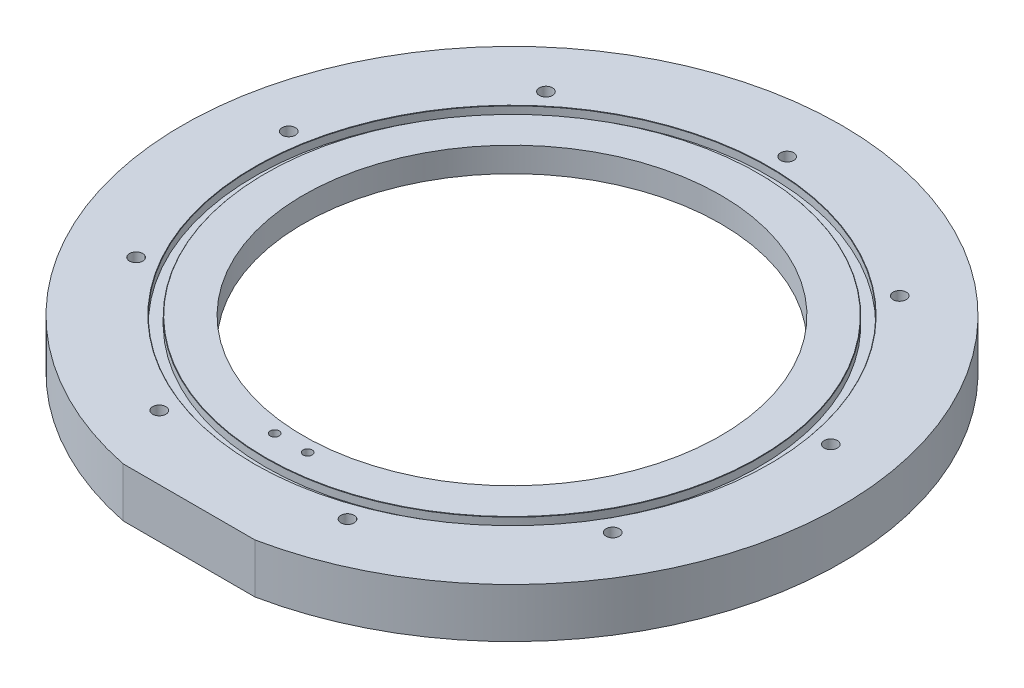
ISO-10303-21;
HEADER;
FILE_DESCRIPTION(('STEP AP214'),'2;1');
FILE_NAME('part.step','',(''),(''),'','','');
FILE_SCHEMA(('AUTOMOTIVE_DESIGN { 1 0 10303 214 1 1 1 1 }'));
ENDSEC;
DATA;
#1=APPLICATION_CONTEXT('core data for automotive mechanical design processes');
#2=APPLICATION_PROTOCOL_DEFINITION('international standard','automotive_design',2000,#1);
#3=PRODUCT_CONTEXT('',#1,'mechanical');
#4=PRODUCT('Part','Part','',(#3));
#5=PRODUCT_RELATED_PRODUCT_CATEGORY('part','',(#4));
#6=PRODUCT_DEFINITION_FORMATION('','',#4);
#7=PRODUCT_DEFINITION_CONTEXT('part definition',#1,'design');
#8=PRODUCT_DEFINITION('design','',#6,#7);
#9=PRODUCT_DEFINITION_SHAPE('','',#8);
#10=(LENGTH_UNIT() NAMED_UNIT(*) SI_UNIT(.MILLI.,.METRE.));
#11=(NAMED_UNIT(*) PLANE_ANGLE_UNIT() SI_UNIT($,.RADIAN.));
#12=(NAMED_UNIT(*) SI_UNIT($,.STERADIAN.) SOLID_ANGLE_UNIT());
#13=UNCERTAINTY_MEASURE_WITH_UNIT(LENGTH_MEASURE(1.E-05),#10,'distance_accuracy_value','');
#14=(GEOMETRIC_REPRESENTATION_CONTEXT(3) GLOBAL_UNCERTAINTY_ASSIGNED_CONTEXT((#13)) GLOBAL_UNIT_ASSIGNED_CONTEXT((#10,
#11,#12)) REPRESENTATION_CONTEXT('',''));
#15=CARTESIAN_POINT('',(0.,0.,0.));
#16=DIRECTION('',(0.,0.,1.));
#17=DIRECTION('',(1.,0.,0.));
#18=AXIS2_PLACEMENT_3D('',#15,#16,#17);
#19=CARTESIAN_POINT('',(105.7783,19.05,0.));
#20=DIRECTION('',(0.,1.,0.));
#21=DIRECTION('',(0.,0.,1.));
#22=AXIS2_PLACEMENT_3D('',#19,#20,#21);
#23=PLANE('',#22);
#24=CARTESIAN_POINT('',(-6.35,19.05,85.09));
#25=DIRECTION('',(0.,1.,0.));
#26=DIRECTION('',(0.,0.,1.));
#27=AXIS2_PLACEMENT_3D('',#24,#25,#26);
#28=CIRCLE('',#27,1.72719999999999);
#29=CARTESIAN_POINT('',(-6.35,19.05,86.8172));
#30=VERTEX_POINT('',#29);
#31=EDGE_CURVE('E627',#30,#30,#28,.T.);
#32=ORIENTED_EDGE('',*,*,#31,.F.);
#33=EDGE_LOOP('',(#32));
#34=FACE_BOUND('',#33,.T.);
#35=CARTESIAN_POINT('',(6.35,19.05,85.09));
#36=DIRECTION('',(0.,1.,0.));
#37=DIRECTION('',(0.,0.,1.));
#38=AXIS2_PLACEMENT_3D('',#35,#36,#37);
#39=CIRCLE('',#38,1.72719999999999);
#40=CARTESIAN_POINT('',(6.35,19.05,86.8172));
#41=VERTEX_POINT('',#40);
#42=EDGE_CURVE('E619',#41,#41,#39,.T.);
#43=ORIENTED_EDGE('',*,*,#42,.F.);
#44=EDGE_LOOP('',(#43));
#45=FACE_BOUND('',#44,.T.);
#46=CARTESIAN_POINT('',(0.,19.05,0.));
#47=DIRECTION('',(0.,1.,0.));
#48=DIRECTION('',(0.,0.,1.));
#49=AXIS2_PLACEMENT_3D('',#46,#47,#48);
#50=CIRCLE('',#49,94.9197999999999);
#51=CARTESIAN_POINT('',(0.,19.05,94.9197999999999));
#52=VERTEX_POINT('',#51);
#53=EDGE_CURVE('E123',#52,#52,#50,.T.);
#54=ORIENTED_EDGE('',*,*,#53,.T.);
#55=EDGE_LOOP('',(#54));
#56=FACE_BOUND('',#55,.T.);
#57=CARTESIAN_POINT('',(0.,19.05,0.));
#58=DIRECTION('',(0.,-1.,0.));
#59=DIRECTION('',(0.,0.,-1.));
#60=AXIS2_PLACEMENT_3D('',#57,#58,#59);
#61=CIRCLE('',#60,80.3783);
#62=CARTESIAN_POINT('',(0.,19.05,-80.3783));
#63=VERTEX_POINT('',#62);
#64=EDGE_CURVE('E119',#63,#63,#61,.T.);
#65=ORIENTED_EDGE('',*,*,#64,.T.);
#66=EDGE_LOOP('',(#65));
#67=FACE_BOUND('',#66,.T.);
#68=ADVANCED_FACE('F44',(#34,#45,#56,#67),#23,.T.);
#69=CARTESIAN_POINT('',(109.7915,0.,0.));
#70=DIRECTION('',(0.,-1.,0.));
#71=DIRECTION('',(0.,0.,-1.));
#72=AXIS2_PLACEMENT_3D('',#69,#70,#71);
#73=PLANE('',#72);
#74=DIRECTION('',(-1.,0.,0.));
#75=VECTOR('',#74,1.);
#76=CARTESIAN_POINT('',(-25.4,0.,124.434078933385));
#77=LINE('',#76,#75);
#78=CARTESIAN_POINT('',(25.4,0.,124.434078933385));
#79=VERTEX_POINT('',#78);
#80=CARTESIAN_POINT('',(-25.4,0.,124.434078933385));
#81=VERTEX_POINT('',#80);
#82=EDGE_CURVE('E106',#79,#81,#77,.T.);
#83=ORIENTED_EDGE('',*,*,#82,.T.);
#84=CARTESIAN_POINT('',(0.,0.,0.));
#85=DIRECTION('',(0.,-1.,0.));
#86=DIRECTION('',(0.,0.,-1.));
#87=AXIS2_PLACEMENT_3D('',#84,#85,#86);
#88=CIRCLE('',#87,127.);
#89=EDGE_CURVE('E113',#81,#79,#88,.T.);
#90=ORIENTED_EDGE('',*,*,#89,.T.);
#91=EDGE_LOOP('',(#83,#90));
#92=FACE_BOUND('',#91,.T.);
#93=CARTESIAN_POINT('',(0.,0.,0.));
#94=DIRECTION('',(0.,-1.,0.));
#95=DIRECTION('',(0.,0.,-1.));
#96=AXIS2_PLACEMENT_3D('',#93,#94,#95);
#97=CIRCLE('',#96,109.7915);
#98=CARTESIAN_POINT('',(0.,0.,-109.7915));
#99=VERTEX_POINT('',#98);
#100=EDGE_CURVE('E535',#99,#99,#97,.T.);
#101=ORIENTED_EDGE('',*,*,#100,.F.);
#102=EDGE_LOOP('',(#101));
#103=FACE_BOUND('',#102,.T.);
#104=ADVANCED_FACE('F157',(#92,#103),#73,.T.);
#105=CARTESIAN_POINT('',(0.,0.,0.));
#106=DIRECTION('',(0.,-1.,0.));
#107=DIRECTION('',(0.,0.,-1.));
#108=AXIS2_PLACEMENT_3D('',#105,#106,#107);
#109=CYLINDRICAL_SURFACE('',#108,127.);
#110=DIRECTION('',(0.,-1.,0.));
#111=VECTOR('',#110,1.);
#112=CARTESIAN_POINT('',(25.4,0.,124.434078933385));
#113=LINE('',#112,#111);
#114=CARTESIAN_POINT('',(25.4,19.05,124.434078933385));
#115=VERTEX_POINT('',#114);
#116=EDGE_CURVE('E61',#115,#79,#113,.T.);
#117=ORIENTED_EDGE('',*,*,#116,.T.);
#118=ORIENTED_EDGE('',*,*,#89,.F.);
#119=DIRECTION('',(0.,-1.,0.));
#120=VECTOR('',#119,1.);
#121=CARTESIAN_POINT('',(-25.4,0.,124.434078933385));
#122=LINE('',#121,#120);
#123=CARTESIAN_POINT('',(-25.4,19.05,124.434078933385));
#124=VERTEX_POINT('',#123);
#125=EDGE_CURVE('E99',#81,#124,#122,.F.);
#126=ORIENTED_EDGE('',*,*,#125,.T.);
#127=CARTESIAN_POINT('',(0.,19.05,0.));
#128=DIRECTION('',(0.,-1.,0.));
#129=DIRECTION('',(0.,0.,-1.));
#130=AXIS2_PLACEMENT_3D('',#127,#128,#129);
#131=CIRCLE('',#130,127.);
#132=EDGE_CURVE('E111',#124,#115,#131,.T.);
#133=ORIENTED_EDGE('',*,*,#132,.T.);
#134=EDGE_LOOP('',(#117,#118,#126,#133));
#135=FACE_BOUND('',#134,.T.);
#136=ADVANCED_FACE('F110',(#135),#109,.T.);
#137=DIRECTION('',(-1.,0.,0.));
#138=VECTOR('',#137,1.);
#139=CARTESIAN_POINT('',(-25.4,19.05,124.434078933385));
#140=LINE('',#139,#138);
#141=EDGE_CURVE('E96',#115,#124,#140,.T.);
#142=ORIENTED_EDGE('',*,*,#141,.F.);
#143=ORIENTED_EDGE('',*,*,#132,.F.);
#144=EDGE_LOOP('',(#142,#143));
#145=FACE_BOUND('',#144,.T.);
#146=CARTESIAN_POINT('',(0.,19.05,0.));
#147=DIRECTION('',(0.,1.,0.));
#148=DIRECTION('',(0.,0.,1.));
#149=AXIS2_PLACEMENT_3D('',#146,#147,#148);
#150=CIRCLE('',#149,99.2378);
#151=CARTESIAN_POINT('',(0.,19.05,99.2378));
#152=VERTEX_POINT('',#151);
#153=EDGE_CURVE('E11',#152,#152,#150,.F.);
#154=ORIENTED_EDGE('',*,*,#153,.T.);
#155=EDGE_LOOP('',(#154));
#156=FACE_BOUND('',#155,.T.);
#157=CARTESIAN_POINT('',(0.,19.05,-106.045));
#158=DIRECTION('',(0.,1.,0.));
#159=DIRECTION('',(0.,0.,1.));
#160=AXIS2_PLACEMENT_3D('',#157,#158,#159);
#161=CIRCLE('',#160,2.55269999999999);
#162=CARTESIAN_POINT('',(0.,19.05,-103.4923));
#163=VERTEX_POINT('',#162);
#164=EDGE_CURVE('E607',#163,#163,#161,.T.);
#165=ORIENTED_EDGE('',*,*,#164,.F.);
#166=EDGE_LOOP('',(#165));
#167=FACE_BOUND('',#166,.T.);
#168=CARTESIAN_POINT('',(68.1644120692091,19.05,-81.235182970552));
#169=DIRECTION('',(0.,1.,0.));
#170=DIRECTION('',(0.,0.,1.));
#171=AXIS2_PLACEMENT_3D('',#168,#169,#170);
#172=CIRCLE('',#171,2.55269999999999);
#173=CARTESIAN_POINT('',(68.1644120692091,19.05,-78.682482970552));
#174=VERTEX_POINT('',#173);
#175=EDGE_CURVE('E599',#174,#174,#172,.T.);
#176=ORIENTED_EDGE('',*,*,#175,.F.);
#177=EDGE_LOOP('',(#176));
#178=FACE_BOUND('',#177,.T.);
#179=CARTESIAN_POINT('',(104.43393816818,19.05,-18.4145210006896));
#180=DIRECTION('',(0.,1.,0.));
#181=DIRECTION('',(0.,0.,1.));
#182=AXIS2_PLACEMENT_3D('',#179,#180,#181);
#183=CIRCLE('',#182,2.55269999999999);
#184=CARTESIAN_POINT('',(104.43393816818,19.05,-15.8618210006896));
#185=VERTEX_POINT('',#184);
#186=EDGE_CURVE('E591',#185,#185,#183,.T.);
#187=ORIENTED_EDGE('',*,*,#186,.F.);
#188=EDGE_LOOP('',(#187));
#189=FACE_BOUND('',#188,.T.);
#190=CARTESIAN_POINT('',(91.8376639443208,19.05,53.0225));
#191=DIRECTION('',(0.,1.,0.));
#192=DIRECTION('',(0.,0.,1.));
#193=AXIS2_PLACEMENT_3D('',#190,#191,#192);
#194=CIRCLE('',#193,2.55269999999999);
#195=CARTESIAN_POINT('',(91.8376639443208,19.05,55.5752));
#196=VERTEX_POINT('',#195);
#197=EDGE_CURVE('E583',#196,#196,#194,.T.);
#198=ORIENTED_EDGE('',*,*,#197,.F.);
#199=EDGE_LOOP('',(#198));
#200=FACE_BOUND('',#199,.T.);
#201=CARTESIAN_POINT('',(36.2695260989706,19.05,99.6497039712416));
#202=DIRECTION('',(0.,1.,0.));
#203=DIRECTION('',(0.,0.,1.));
#204=AXIS2_PLACEMENT_3D('',#201,#202,#203);
#205=CIRCLE('',#204,2.55269999999999);
#206=CARTESIAN_POINT('',(36.2695260989706,19.05,102.202403971242));
#207=VERTEX_POINT('',#206);
#208=EDGE_CURVE('E575',#207,#207,#205,.T.);
#209=ORIENTED_EDGE('',*,*,#208,.F.);
#210=EDGE_LOOP('',(#209));
#211=FACE_BOUND('',#210,.T.);
#212=CARTESIAN_POINT('',(-36.2695260989705,19.05,99.6497039712416));
#213=DIRECTION('',(0.,1.,0.));
#214=DIRECTION('',(0.,0.,1.));
#215=AXIS2_PLACEMENT_3D('',#212,#213,#214);
#216=CIRCLE('',#215,2.55269999999999);
#217=CARTESIAN_POINT('',(-36.2695260989705,19.05,102.202403971242));
#218=VERTEX_POINT('',#217);
#219=EDGE_CURVE('E567',#218,#218,#216,.T.);
#220=ORIENTED_EDGE('',*,*,#219,.F.);
#221=EDGE_LOOP('',(#220));
#222=FACE_BOUND('',#221,.T.);
#223=CARTESIAN_POINT('',(-91.8376639443208,19.05,53.0225));
#224=DIRECTION('',(0.,1.,0.));
#225=DIRECTION('',(0.,0.,1.));
#226=AXIS2_PLACEMENT_3D('',#223,#224,#225);
#227=CIRCLE('',#226,2.55269999999999);
#228=CARTESIAN_POINT('',(-91.8376639443208,19.05,55.5752));
#229=VERTEX_POINT('',#228);
#230=EDGE_CURVE('E559',#229,#229,#227,.T.);
#231=ORIENTED_EDGE('',*,*,#230,.F.);
#232=EDGE_LOOP('',(#231));
#233=FACE_BOUND('',#232,.T.);
#234=CARTESIAN_POINT('',(-104.43393816818,19.05,-18.4145210006896));
#235=DIRECTION('',(0.,1.,0.));
#236=DIRECTION('',(0.,0.,1.));
#237=AXIS2_PLACEMENT_3D('',#234,#235,#236);
#238=CIRCLE('',#237,2.55269999999999);
#239=CARTESIAN_POINT('',(-104.43393816818,19.05,-15.8618210006896));
#240=VERTEX_POINT('',#239);
#241=EDGE_CURVE('E551',#240,#240,#238,.T.);
#242=ORIENTED_EDGE('',*,*,#241,.F.);
#243=EDGE_LOOP('',(#242));
#244=FACE_BOUND('',#243,.T.);
#245=CARTESIAN_POINT('',(-68.1644120692091,19.05,-81.235182970552));
#246=DIRECTION('',(0.,1.,0.));
#247=DIRECTION('',(0.,0.,1.));
#248=AXIS2_PLACEMENT_3D('',#245,#246,#247);
#249=CIRCLE('',#248,2.55269999999999);
#250=CARTESIAN_POINT('',(-68.1644120692091,19.05,-78.682482970552));
#251=VERTEX_POINT('',#250);
#252=EDGE_CURVE('E543',#251,#251,#249,.T.);
#253=ORIENTED_EDGE('',*,*,#252,.F.);
#254=EDGE_LOOP('',(#253));
#255=FACE_BOUND('',#254,.T.);
#256=ADVANCED_FACE('F116',(#145,#156,#167,#178,#189,#200,#211,#222,#233,#244,#255),#23,.T.);
#257=CARTESIAN_POINT('',(0.,0.,0.));
#258=DIRECTION('',(0.,-1.,0.));
#259=DIRECTION('',(0.,0.,-1.));
#260=AXIS2_PLACEMENT_3D('',#257,#258,#259);
#261=CYLINDRICAL_SURFACE('',#260,80.3783);
#262=CARTESIAN_POINT('',(0.,9.52499999999999,0.));
#263=DIRECTION('',(0.,-1.,0.));
#264=DIRECTION('',(0.,0.,-1.));
#265=AXIS2_PLACEMENT_3D('',#262,#263,#264);
#266=CIRCLE('',#265,80.3783);
#267=CARTESIAN_POINT('',(0.,9.52499999999999,-80.3783));
#268=VERTEX_POINT('',#267);
#269=EDGE_CURVE('E126',#268,#268,#266,.T.);
#270=ORIENTED_EDGE('',*,*,#269,.T.);
#271=EDGE_LOOP('',(#270));
#272=FACE_BOUND('',#271,.T.);
#273=ORIENTED_EDGE('',*,*,#64,.F.);
#274=EDGE_LOOP('',(#273));
#275=FACE_BOUND('',#274,.T.);
#276=ADVANCED_FACE('F170',(#272,#275),#261,.F.);
#277=CARTESIAN_POINT('',(80.3783,9.525,0.));
#278=DIRECTION('',(0.,-1.,0.));
#279=DIRECTION('',(0.,0.,-1.));
#280=AXIS2_PLACEMENT_3D('',#277,#278,#279);
#281=PLANE('',#280);
#282=CARTESIAN_POINT('',(-6.35,9.52499999999999,85.09));
#283=DIRECTION('',(0.,-1.,0.));
#284=DIRECTION('',(0.,0.,-1.));
#285=AXIS2_PLACEMENT_3D('',#282,#283,#284);
#286=CIRCLE('',#285,1.72719999999999);
#287=CARTESIAN_POINT('',(-6.35,9.52499999999999,83.3628));
#288=VERTEX_POINT('',#287);
#289=EDGE_CURVE('E105',#288,#288,#286,.T.);
#290=ORIENTED_EDGE('',*,*,#289,.F.);
#291=EDGE_LOOP('',(#290));
#292=FACE_BOUND('',#291,.T.);
#293=CARTESIAN_POINT('',(6.35,9.52499999999999,85.09));
#294=DIRECTION('',(0.,-1.,0.));
#295=DIRECTION('',(0.,0.,-1.));
#296=AXIS2_PLACEMENT_3D('',#293,#294,#295);
#297=CIRCLE('',#296,1.72719999999999);
#298=CARTESIAN_POINT('',(6.35,9.52499999999999,83.3628));
#299=VERTEX_POINT('',#298);
#300=EDGE_CURVE('E623',#299,#299,#297,.T.);
#301=ORIENTED_EDGE('',*,*,#300,.F.);
#302=EDGE_LOOP('',(#301));
#303=FACE_BOUND('',#302,.T.);
#304=CARTESIAN_POINT('',(0.,9.525,0.));
#305=DIRECTION('',(0.,-1.,0.));
#306=DIRECTION('',(0.,0.,-1.));
#307=AXIS2_PLACEMENT_3D('',#304,#305,#306);
#308=CIRCLE('',#307,99.4283);
#309=CARTESIAN_POINT('',(0.,9.525,-99.4283));
#310=VERTEX_POINT('',#309);
#311=EDGE_CURVE('E522',#310,#310,#308,.T.);
#312=ORIENTED_EDGE('',*,*,#311,.T.);
#313=EDGE_LOOP('',(#312));
#314=FACE_BOUND('',#313,.T.);
#315=ORIENTED_EDGE('',*,*,#269,.F.);
#316=EDGE_LOOP('',(#315));
#317=FACE_BOUND('',#316,.T.);
#318=ADVANCED_FACE('F175',(#292,#303,#314,#317),#281,.T.);
#319=CARTESIAN_POINT('',(0.,0.,0.));
#320=DIRECTION('',(0.,-1.,0.));
#321=DIRECTION('',(0.,0.,-1.));
#322=AXIS2_PLACEMENT_3D('',#319,#320,#321);
#323=CYLINDRICAL_SURFACE('',#322,99.4283);
#324=CARTESIAN_POINT('',(0.,2.54,0.));
#325=DIRECTION('',(0.,-1.,0.));
#326=DIRECTION('',(0.,0.,-1.));
#327=AXIS2_PLACEMENT_3D('',#324,#325,#326);
#328=CIRCLE('',#327,99.4283);
#329=CARTESIAN_POINT('',(0.,2.54,-99.4283));
#330=VERTEX_POINT('',#329);
#331=EDGE_CURVE('E519',#330,#330,#328,.T.);
#332=ORIENTED_EDGE('',*,*,#331,.T.);
#333=EDGE_LOOP('',(#332));
#334=FACE_BOUND('',#333,.T.);
#335=ORIENTED_EDGE('',*,*,#311,.F.);
#336=EDGE_LOOP('',(#335));
#337=FACE_BOUND('',#336,.T.);
#338=ADVANCED_FACE('F216',(#334,#337),#323,.F.);
#339=CARTESIAN_POINT('',(109.7915,2.54,0.));
#340=DIRECTION('',(0.,-1.,0.));
#341=DIRECTION('',(0.,0.,-1.));
#342=AXIS2_PLACEMENT_3D('',#339,#340,#341);
#343=PLANE('',#342);
#344=CARTESIAN_POINT('',(0.,2.54,0.));
#345=DIRECTION('',(0.,-1.,0.));
#346=DIRECTION('',(0.,0.,-1.));
#347=AXIS2_PLACEMENT_3D('',#344,#345,#346);
#348=CIRCLE('',#347,109.7915);
#349=CARTESIAN_POINT('',(0.,2.54,-109.7915));
#350=VERTEX_POINT('',#349);
#351=EDGE_CURVE('E529',#350,#350,#348,.T.);
#352=ORIENTED_EDGE('',*,*,#351,.T.);
#353=EDGE_LOOP('',(#352));
#354=FACE_BOUND('',#353,.T.);
#355=ORIENTED_EDGE('',*,*,#331,.F.);
#356=EDGE_LOOP('',(#355));
#357=FACE_BOUND('',#356,.T.);
#358=ADVANCED_FACE('F469',(#354,#357),#343,.T.);
#359=CARTESIAN_POINT('',(0.,0.,0.));
#360=DIRECTION('',(0.,-1.,0.));
#361=DIRECTION('',(0.,0.,-1.));
#362=AXIS2_PLACEMENT_3D('',#359,#360,#361);
#363=CYLINDRICAL_SURFACE('',#362,109.7915);
#364=ORIENTED_EDGE('',*,*,#100,.T.);
#365=EDGE_LOOP('',(#364));
#366=FACE_BOUND('',#365,.T.);
#367=ORIENTED_EDGE('',*,*,#351,.F.);
#368=EDGE_LOOP('',(#367));
#369=FACE_BOUND('',#368,.T.);
#370=ADVANCED_FACE('F460',(#366,#369),#363,.F.);
#371=CARTESIAN_POINT('',(-68.1644120692091,5.715,-81.235182970552));
#372=DIRECTION('',(0.,1.,0.));
#373=DIRECTION('',(0.,0.,1.));
#374=AXIS2_PLACEMENT_3D('',#371,#372,#373);
#375=CONICAL_SURFACE('',#374,2.55269999999999,1.02974425867665);
#376=CARTESIAN_POINT('',(-68.1644120692091,4.18118309780834,-81.235182970552));
#377=VERTEX_POINT('',#376);
#378=VERTEX_LOOP('',#377);
#379=FACE_BOUND('',#378,.T.);
#380=CARTESIAN_POINT('',(-68.1644120692091,5.715,-81.235182970552));
#381=DIRECTION('',(0.,1.,0.));
#382=DIRECTION('',(0.,0.,1.));
#383=AXIS2_PLACEMENT_3D('',#380,#381,#382);
#384=CIRCLE('',#383,2.55269999999999);
#385=CARTESIAN_POINT('',(-68.1644120692091,5.715,-78.682482970552));
#386=VERTEX_POINT('',#385);
#387=EDGE_CURVE('E539',#386,#386,#384,.T.);
#388=ORIENTED_EDGE('',*,*,#387,.T.);
#389=EDGE_LOOP('',(#388));
#390=FACE_BOUND('',#389,.T.);
#391=ADVANCED_FACE('F449',(#379,#390),#375,.F.);
#392=CARTESIAN_POINT('',(-68.1644120692091,19.05,-81.235182970552));
#393=DIRECTION('',(0.,1.,0.));
#394=DIRECTION('',(0.,0.,1.));
#395=AXIS2_PLACEMENT_3D('',#392,#393,#394);
#396=CYLINDRICAL_SURFACE('',#395,2.55269999999999);
#397=ORIENTED_EDGE('',*,*,#387,.F.);
#398=EDGE_LOOP('',(#397));
#399=FACE_BOUND('',#398,.T.);
#400=ORIENTED_EDGE('',*,*,#252,.T.);
#401=EDGE_LOOP('',(#400));
#402=FACE_BOUND('',#401,.T.);
#403=ADVANCED_FACE('F439',(#399,#402),#396,.F.);
#404=CARTESIAN_POINT('',(-104.43393816818,5.715,-18.4145210006896));
#405=DIRECTION('',(0.,1.,0.));
#406=DIRECTION('',(0.,0.,1.));
#407=AXIS2_PLACEMENT_3D('',#404,#405,#406);
#408=CONICAL_SURFACE('',#407,2.55269999999999,1.02974425867665);
#409=CARTESIAN_POINT('',(-104.43393816818,4.18118309780834,-18.4145210006896));
#410=VERTEX_POINT('',#409);
#411=VERTEX_LOOP('',#410);
#412=FACE_BOUND('',#411,.T.);
#413=CARTESIAN_POINT('',(-104.43393816818,5.715,-18.4145210006896));
#414=DIRECTION('',(0.,1.,0.));
#415=DIRECTION('',(0.,0.,1.));
#416=AXIS2_PLACEMENT_3D('',#413,#414,#415);
#417=CIRCLE('',#416,2.55269999999999);
#418=CARTESIAN_POINT('',(-104.43393816818,5.715,-15.8618210006896));
#419=VERTEX_POINT('',#418);
#420=EDGE_CURVE('E547',#419,#419,#417,.T.);
#421=ORIENTED_EDGE('',*,*,#420,.T.);
#422=EDGE_LOOP('',(#421));
#423=FACE_BOUND('',#422,.T.);
#424=ADVANCED_FACE('F428',(#412,#423),#408,.F.);
#425=CARTESIAN_POINT('',(-104.43393816818,19.05,-18.4145210006896));
#426=DIRECTION('',(0.,1.,0.));
#427=DIRECTION('',(0.,0.,1.));
#428=AXIS2_PLACEMENT_3D('',#425,#426,#427);
#429=CYLINDRICAL_SURFACE('',#428,2.55269999999999);
#430=ORIENTED_EDGE('',*,*,#420,.F.);
#431=EDGE_LOOP('',(#430));
#432=FACE_BOUND('',#431,.T.);
#433=ORIENTED_EDGE('',*,*,#241,.T.);
#434=EDGE_LOOP('',(#433));
#435=FACE_BOUND('',#434,.T.);
#436=ADVANCED_FACE('F418',(#432,#435),#429,.F.);
#437=CARTESIAN_POINT('',(-91.8376639443208,5.715,53.0225));
#438=DIRECTION('',(0.,1.,0.));
#439=DIRECTION('',(0.,0.,1.));
#440=AXIS2_PLACEMENT_3D('',#437,#438,#439);
#441=CONICAL_SURFACE('',#440,2.55269999999999,1.02974425867665);
#442=CARTESIAN_POINT('',(-91.8376639443208,4.18118309780834,53.0225));
#443=VERTEX_POINT('',#442);
#444=VERTEX_LOOP('',#443);
#445=FACE_BOUND('',#444,.T.);
#446=CARTESIAN_POINT('',(-91.8376639443208,5.715,53.0225));
#447=DIRECTION('',(0.,1.,0.));
#448=DIRECTION('',(0.,0.,1.));
#449=AXIS2_PLACEMENT_3D('',#446,#447,#448);
#450=CIRCLE('',#449,2.55269999999999);
#451=CARTESIAN_POINT('',(-91.8376639443208,5.715,55.5752));
#452=VERTEX_POINT('',#451);
#453=EDGE_CURVE('E555',#452,#452,#450,.T.);
#454=ORIENTED_EDGE('',*,*,#453,.T.);
#455=EDGE_LOOP('',(#454));
#456=FACE_BOUND('',#455,.T.);
#457=ADVANCED_FACE('F406',(#445,#456),#441,.F.);
#458=CARTESIAN_POINT('',(-91.8376639443208,19.05,53.0225));
#459=DIRECTION('',(0.,1.,0.));
#460=DIRECTION('',(0.,0.,1.));
#461=AXIS2_PLACEMENT_3D('',#458,#459,#460);
#462=CYLINDRICAL_SURFACE('',#461,2.55269999999999);
#463=ORIENTED_EDGE('',*,*,#453,.F.);
#464=EDGE_LOOP('',(#463));
#465=FACE_BOUND('',#464,.T.);
#466=ORIENTED_EDGE('',*,*,#230,.T.);
#467=EDGE_LOOP('',(#466));
#468=FACE_BOUND('',#467,.T.);
#469=ADVANCED_FACE('F396',(#465,#468),#462,.F.);
#470=CARTESIAN_POINT('',(-36.2695260989705,5.715,99.6497039712416));
#471=DIRECTION('',(0.,1.,0.));
#472=DIRECTION('',(0.,0.,1.));
#473=AXIS2_PLACEMENT_3D('',#470,#471,#472);
#474=CONICAL_SURFACE('',#473,2.5527,1.02974425867665);
#475=CARTESIAN_POINT('',(-36.2695260989705,4.18118309780834,99.6497039712416));
#476=VERTEX_POINT('',#475);
#477=VERTEX_LOOP('',#476);
#478=FACE_BOUND('',#477,.T.);
#479=CARTESIAN_POINT('',(-36.2695260989705,5.715,99.6497039712416));
#480=DIRECTION('',(0.,1.,0.));
#481=DIRECTION('',(0.,0.,1.));
#482=AXIS2_PLACEMENT_3D('',#479,#480,#481);
#483=CIRCLE('',#482,2.5527);
#484=CARTESIAN_POINT('',(-36.2695260989705,5.715,102.202403971242));
#485=VERTEX_POINT('',#484);
#486=EDGE_CURVE('E563',#485,#485,#483,.T.);
#487=ORIENTED_EDGE('',*,*,#486,.T.);
#488=EDGE_LOOP('',(#487));
#489=FACE_BOUND('',#488,.T.);
#490=ADVANCED_FACE('F384',(#478,#489),#474,.F.);
#491=CARTESIAN_POINT('',(-36.2695260989705,19.05,99.6497039712416));
#492=DIRECTION('',(0.,1.,0.));
#493=DIRECTION('',(0.,0.,1.));
#494=AXIS2_PLACEMENT_3D('',#491,#492,#493);
#495=CYLINDRICAL_SURFACE('',#494,2.55269999999999);
#496=ORIENTED_EDGE('',*,*,#486,.F.);
#497=EDGE_LOOP('',(#496));
#498=FACE_BOUND('',#497,.T.);
#499=ORIENTED_EDGE('',*,*,#219,.T.);
#500=EDGE_LOOP('',(#499));
#501=FACE_BOUND('',#500,.T.);
#502=ADVANCED_FACE('F374',(#498,#501),#495,.F.);
#503=CARTESIAN_POINT('',(36.2695260989706,5.715,99.6497039712416));
#504=DIRECTION('',(0.,1.,0.));
#505=DIRECTION('',(0.,0.,1.));
#506=AXIS2_PLACEMENT_3D('',#503,#504,#505);
#507=CONICAL_SURFACE('',#506,2.5527,1.02974425867665);
#508=CARTESIAN_POINT('',(36.2695260989706,4.18118309780834,99.6497039712416));
#509=VERTEX_POINT('',#508);
#510=VERTEX_LOOP('',#509);
#511=FACE_BOUND('',#510,.T.);
#512=CARTESIAN_POINT('',(36.2695260989706,5.715,99.6497039712416));
#513=DIRECTION('',(0.,1.,0.));
#514=DIRECTION('',(0.,0.,1.));
#515=AXIS2_PLACEMENT_3D('',#512,#513,#514);
#516=CIRCLE('',#515,2.5527);
#517=CARTESIAN_POINT('',(36.2695260989706,5.715,102.202403971242));
#518=VERTEX_POINT('',#517);
#519=EDGE_CURVE('E571',#518,#518,#516,.T.);
#520=ORIENTED_EDGE('',*,*,#519,.T.);
#521=EDGE_LOOP('',(#520));
#522=FACE_BOUND('',#521,.T.);
#523=ADVANCED_FACE('F362',(#511,#522),#507,.F.);
#524=CARTESIAN_POINT('',(36.2695260989706,19.05,99.6497039712416));
#525=DIRECTION('',(0.,1.,0.));
#526=DIRECTION('',(0.,0.,1.));
#527=AXIS2_PLACEMENT_3D('',#524,#525,#526);
#528=CYLINDRICAL_SURFACE('',#527,2.55269999999999);
#529=ORIENTED_EDGE('',*,*,#519,.F.);
#530=EDGE_LOOP('',(#529));
#531=FACE_BOUND('',#530,.T.);
#532=ORIENTED_EDGE('',*,*,#208,.T.);
#533=EDGE_LOOP('',(#532));
#534=FACE_BOUND('',#533,.T.);
#535=ADVANCED_FACE('F352',(#531,#534),#528,.F.);
#536=CARTESIAN_POINT('',(91.8376639443208,5.715,53.0225));
#537=DIRECTION('',(0.,1.,0.));
#538=DIRECTION('',(0.,0.,1.));
#539=AXIS2_PLACEMENT_3D('',#536,#537,#538);
#540=CONICAL_SURFACE('',#539,2.55269999999999,1.02974425867665);
#541=CARTESIAN_POINT('',(91.8376639443208,4.18118309780834,53.0225));
#542=VERTEX_POINT('',#541);
#543=VERTEX_LOOP('',#542);
#544=FACE_BOUND('',#543,.T.);
#545=CARTESIAN_POINT('',(91.8376639443208,5.715,53.0225));
#546=DIRECTION('',(0.,1.,0.));
#547=DIRECTION('',(0.,0.,1.));
#548=AXIS2_PLACEMENT_3D('',#545,#546,#547);
#549=CIRCLE('',#548,2.55269999999999);
#550=CARTESIAN_POINT('',(91.8376639443208,5.715,55.5752));
#551=VERTEX_POINT('',#550);
#552=EDGE_CURVE('E579',#551,#551,#549,.T.);
#553=ORIENTED_EDGE('',*,*,#552,.T.);
#554=EDGE_LOOP('',(#553));
#555=FACE_BOUND('',#554,.T.);
#556=ADVANCED_FACE('F340',(#544,#555),#540,.F.);
#557=CARTESIAN_POINT('',(91.8376639443208,19.05,53.0225));
#558=DIRECTION('',(0.,1.,0.));
#559=DIRECTION('',(0.,0.,1.));
#560=AXIS2_PLACEMENT_3D('',#557,#558,#559);
#561=CYLINDRICAL_SURFACE('',#560,2.55269999999999);
#562=ORIENTED_EDGE('',*,*,#552,.F.);
#563=EDGE_LOOP('',(#562));
#564=FACE_BOUND('',#563,.T.);
#565=ORIENTED_EDGE('',*,*,#197,.T.);
#566=EDGE_LOOP('',(#565));
#567=FACE_BOUND('',#566,.T.);
#568=ADVANCED_FACE('F330',(#564,#567),#561,.F.);
#569=CARTESIAN_POINT('',(104.43393816818,5.715,-18.4145210006896));
#570=DIRECTION('',(0.,1.,0.));
#571=DIRECTION('',(0.,0.,1.));
#572=AXIS2_PLACEMENT_3D('',#569,#570,#571);
#573=CONICAL_SURFACE('',#572,2.55269999999999,1.02974425867665);
#574=CARTESIAN_POINT('',(104.43393816818,4.18118309780834,-18.4145210006896));
#575=VERTEX_POINT('',#574);
#576=VERTEX_LOOP('',#575);
#577=FACE_BOUND('',#576,.T.);
#578=CARTESIAN_POINT('',(104.43393816818,5.715,-18.4145210006896));
#579=DIRECTION('',(0.,1.,0.));
#580=DIRECTION('',(0.,0.,1.));
#581=AXIS2_PLACEMENT_3D('',#578,#579,#580);
#582=CIRCLE('',#581,2.55269999999999);
#583=CARTESIAN_POINT('',(104.43393816818,5.715,-15.8618210006896));
#584=VERTEX_POINT('',#583);
#585=EDGE_CURVE('E587',#584,#584,#582,.T.);
#586=ORIENTED_EDGE('',*,*,#585,.T.);
#587=EDGE_LOOP('',(#586));
#588=FACE_BOUND('',#587,.T.);
#589=ADVANCED_FACE('F318',(#577,#588),#573,.F.);
#590=CARTESIAN_POINT('',(104.43393816818,19.05,-18.4145210006896));
#591=DIRECTION('',(0.,1.,0.));
#592=DIRECTION('',(0.,0.,1.));
#593=AXIS2_PLACEMENT_3D('',#590,#591,#592);
#594=CYLINDRICAL_SURFACE('',#593,2.55269999999999);
#595=ORIENTED_EDGE('',*,*,#585,.F.);
#596=EDGE_LOOP('',(#595));
#597=FACE_BOUND('',#596,.T.);
#598=ORIENTED_EDGE('',*,*,#186,.T.);
#599=EDGE_LOOP('',(#598));
#600=FACE_BOUND('',#599,.T.);
#601=ADVANCED_FACE('F308',(#597,#600),#594,.F.);
#602=CARTESIAN_POINT('',(68.1644120692091,5.715,-81.235182970552));
#603=DIRECTION('',(0.,1.,0.));
#604=DIRECTION('',(0.,0.,1.));
#605=AXIS2_PLACEMENT_3D('',#602,#603,#604);
#606=CONICAL_SURFACE('',#605,2.55269999999999,1.02974425867665);
#607=CARTESIAN_POINT('',(68.1644120692091,4.18118309780834,-81.235182970552));
#608=VERTEX_POINT('',#607);
#609=VERTEX_LOOP('',#608);
#610=FACE_BOUND('',#609,.T.);
#611=CARTESIAN_POINT('',(68.1644120692091,5.715,-81.235182970552));
#612=DIRECTION('',(0.,1.,0.));
#613=DIRECTION('',(0.,0.,1.));
#614=AXIS2_PLACEMENT_3D('',#611,#612,#613);
#615=CIRCLE('',#614,2.55269999999999);
#616=CARTESIAN_POINT('',(68.1644120692091,5.715,-78.682482970552));
#617=VERTEX_POINT('',#616);
#618=EDGE_CURVE('E595',#617,#617,#615,.T.);
#619=ORIENTED_EDGE('',*,*,#618,.T.);
#620=EDGE_LOOP('',(#619));
#621=FACE_BOUND('',#620,.T.);
#622=ADVANCED_FACE('F296',(#610,#621),#606,.F.);
#623=CARTESIAN_POINT('',(68.1644120692091,19.05,-81.235182970552));
#624=DIRECTION('',(0.,1.,0.));
#625=DIRECTION('',(0.,0.,1.));
#626=AXIS2_PLACEMENT_3D('',#623,#624,#625);
#627=CYLINDRICAL_SURFACE('',#626,2.55269999999999);
#628=ORIENTED_EDGE('',*,*,#618,.F.);
#629=EDGE_LOOP('',(#628));
#630=FACE_BOUND('',#629,.T.);
#631=ORIENTED_EDGE('',*,*,#175,.T.);
#632=EDGE_LOOP('',(#631));
#633=FACE_BOUND('',#632,.T.);
#634=ADVANCED_FACE('F286',(#630,#633),#627,.F.);
#635=CARTESIAN_POINT('',(0.,5.715,-106.045));
#636=DIRECTION('',(0.,1.,0.));
#637=DIRECTION('',(0.,0.,1.));
#638=AXIS2_PLACEMENT_3D('',#635,#636,#637);
#639=CONICAL_SURFACE('',#638,2.5527,1.02974425867665);
#640=CARTESIAN_POINT('',(0.,4.18118309780834,-106.045));
#641=VERTEX_POINT('',#640);
#642=VERTEX_LOOP('',#641);
#643=FACE_BOUND('',#642,.T.);
#644=CARTESIAN_POINT('',(0.,5.715,-106.045));
#645=DIRECTION('',(0.,1.,0.));
#646=DIRECTION('',(0.,0.,1.));
#647=AXIS2_PLACEMENT_3D('',#644,#645,#646);
#648=CIRCLE('',#647,2.5527);
#649=CARTESIAN_POINT('',(0.,5.715,-103.4923));
#650=VERTEX_POINT('',#649);
#651=EDGE_CURVE('E603',#650,#650,#648,.T.);
#652=ORIENTED_EDGE('',*,*,#651,.T.);
#653=EDGE_LOOP('',(#652));
#654=FACE_BOUND('',#653,.T.);
#655=ADVANCED_FACE('F274',(#643,#654),#639,.F.);
#656=CARTESIAN_POINT('',(0.,19.05,-106.045));
#657=DIRECTION('',(0.,1.,0.));
#658=DIRECTION('',(0.,0.,1.));
#659=AXIS2_PLACEMENT_3D('',#656,#657,#658);
#660=CYLINDRICAL_SURFACE('',#659,2.55269999999999);
#661=ORIENTED_EDGE('',*,*,#651,.F.);
#662=EDGE_LOOP('',(#661));
#663=FACE_BOUND('',#662,.T.);
#664=ORIENTED_EDGE('',*,*,#164,.T.);
#665=EDGE_LOOP('',(#664));
#666=FACE_BOUND('',#665,.T.);
#667=ADVANCED_FACE('F256',(#663,#666),#660,.F.);
#668=CARTESIAN_POINT('',(0.,19.05,0.));
#669=DIRECTION('',(0.,1.,0.));
#670=DIRECTION('',(0.,0.,1.));
#671=AXIS2_PLACEMENT_3D('',#668,#669,#670);
#672=CYLINDRICAL_SURFACE('',#671,95.0468);
#673=CARTESIAN_POINT('',(0.,18.923,0.));
#674=DIRECTION('',(0.,1.,0.));
#675=DIRECTION('',(0.,0.,1.));
#676=AXIS2_PLACEMENT_3D('',#673,#674,#675);
#677=CIRCLE('',#676,95.0468);
#678=CARTESIAN_POINT('',(0.,18.923,95.0468));
#679=VERTEX_POINT('',#678);
#680=EDGE_CURVE('E133',#679,#679,#677,.F.);
#681=ORIENTED_EDGE('',*,*,#680,.T.);
#682=EDGE_LOOP('',(#681));
#683=FACE_BOUND('',#682,.T.);
#684=CARTESIAN_POINT('',(0.,15.9766,0.));
#685=DIRECTION('',(0.,1.,0.));
#686=DIRECTION('',(0.,0.,1.));
#687=AXIS2_PLACEMENT_3D('',#684,#685,#686);
#688=CIRCLE('',#687,95.0468);
#689=CARTESIAN_POINT('',(0.,15.9766,95.0468));
#690=VERTEX_POINT('',#689);
#691=EDGE_CURVE('E611',#690,#690,#688,.T.);
#692=ORIENTED_EDGE('',*,*,#691,.T.);
#693=EDGE_LOOP('',(#692));
#694=FACE_BOUND('',#693,.T.);
#695=ADVANCED_FACE('F252',(#683,#694),#672,.T.);
#696=CARTESIAN_POINT('',(95.0468,15.9766,0.));
#697=DIRECTION('',(0.,1.,0.));
#698=DIRECTION('',(0.,0.,1.));
#699=AXIS2_PLACEMENT_3D('',#696,#697,#698);
#700=PLANE('',#699);
#701=CARTESIAN_POINT('',(0.,15.9766,0.));
#702=DIRECTION('',(0.,1.,0.));
#703=DIRECTION('',(0.,0.,1.));
#704=AXIS2_PLACEMENT_3D('',#701,#702,#703);
#705=CIRCLE('',#704,99.1108);
#706=CARTESIAN_POINT('',(0.,15.9766,99.1108));
#707=VERTEX_POINT('',#706);
#708=EDGE_CURVE('E615',#707,#707,#705,.T.);
#709=ORIENTED_EDGE('',*,*,#708,.T.);
#710=EDGE_LOOP('',(#709));
#711=FACE_BOUND('',#710,.T.);
#712=ORIENTED_EDGE('',*,*,#691,.F.);
#713=EDGE_LOOP('',(#712));
#714=FACE_BOUND('',#713,.T.);
#715=ADVANCED_FACE('F245',(#711,#714),#700,.T.);
#716=CARTESIAN_POINT('',(0.,19.05,0.));
#717=DIRECTION('',(0.,1.,0.));
#718=DIRECTION('',(0.,0.,1.));
#719=AXIS2_PLACEMENT_3D('',#716,#717,#718);
#720=CYLINDRICAL_SURFACE('',#719,99.1108);
#721=CARTESIAN_POINT('',(0.,18.9229999999999,0.));
#722=DIRECTION('',(0.,1.,0.));
#723=DIRECTION('',(0.,0.,1.));
#724=AXIS2_PLACEMENT_3D('',#721,#722,#723);
#725=CIRCLE('',#724,99.1108);
#726=CARTESIAN_POINT('',(0.,18.9229999999999,99.1108));
#727=VERTEX_POINT('',#726);
#728=EDGE_CURVE('E54',#727,#727,#725,.T.);
#729=ORIENTED_EDGE('',*,*,#728,.T.);
#730=EDGE_LOOP('',(#729));
#731=FACE_BOUND('',#730,.T.);
#732=ORIENTED_EDGE('',*,*,#708,.F.);
#733=EDGE_LOOP('',(#732));
#734=FACE_BOUND('',#733,.T.);
#735=ADVANCED_FACE('F140',(#731,#734),#720,.F.);
#736=CARTESIAN_POINT('',(0.,19.05,0.));
#737=DIRECTION('',(0.,-1.,0.));
#738=DIRECTION('',(0.,0.,-1.));
#739=AXIS2_PLACEMENT_3D('',#736,#737,#738);
#740=CONICAL_SURFACE('',#739,94.9197999999999,0.785398163397667);
#741=ORIENTED_EDGE('',*,*,#680,.F.);
#742=EDGE_LOOP('',(#741));
#743=FACE_BOUND('',#742,.T.);
#744=ORIENTED_EDGE('',*,*,#53,.F.);
#745=EDGE_LOOP('',(#744));
#746=FACE_BOUND('',#745,.T.);
#747=ADVANCED_FACE('F145',(#743,#746),#740,.T.);
#748=CARTESIAN_POINT('',(0.,18.9229999999999,0.));
#749=DIRECTION('',(0.,1.,0.));
#750=DIRECTION('',(0.,0.,1.));
#751=AXIS2_PLACEMENT_3D('',#748,#749,#750);
#752=CONICAL_SURFACE('',#751,99.1108,0.785398163397394);
#753=ORIENTED_EDGE('',*,*,#153,.F.);
#754=EDGE_LOOP('',(#753));
#755=FACE_BOUND('',#754,.T.);
#756=ORIENTED_EDGE('',*,*,#728,.F.);
#757=EDGE_LOOP('',(#756));
#758=FACE_BOUND('',#757,.T.);
#759=ADVANCED_FACE('F47',(#755,#758),#752,.F.);
#760=CARTESIAN_POINT('',(6.35,9.525,85.09));
#761=DIRECTION('',(0.,-1.,0.));
#762=DIRECTION('',(0.,0.,-1.));
#763=AXIS2_PLACEMENT_3D('',#760,#761,#762);
#764=CYLINDRICAL_SURFACE('',#763,1.72719999999999);
#765=ORIENTED_EDGE('',*,*,#300,.T.);
#766=EDGE_LOOP('',(#765));
#767=FACE_BOUND('',#766,.T.);
#768=ORIENTED_EDGE('',*,*,#42,.T.);
#769=EDGE_LOOP('',(#768));
#770=FACE_BOUND('',#769,.T.);
#771=ADVANCED_FACE('F144',(#767,#770),#764,.F.);
#772=CARTESIAN_POINT('',(-6.35,9.525,85.09));
#773=DIRECTION('',(0.,-1.,0.));
#774=DIRECTION('',(0.,0.,-1.));
#775=AXIS2_PLACEMENT_3D('',#772,#773,#774);
#776=CYLINDRICAL_SURFACE('',#775,1.72719999999999);
#777=ORIENTED_EDGE('',*,*,#289,.T.);
#778=EDGE_LOOP('',(#777));
#779=FACE_BOUND('',#778,.T.);
#780=ORIENTED_EDGE('',*,*,#31,.T.);
#781=EDGE_LOOP('',(#780));
#782=FACE_BOUND('',#781,.T.);
#783=ADVANCED_FACE('F151',(#779,#782),#776,.F.);
#784=CARTESIAN_POINT('',(-25.4,-0.001000000000001,124.434078933385));
#785=DIRECTION('',(0.,0.,-1.));
#786=DIRECTION('',(-1.,0.,0.));
#787=AXIS2_PLACEMENT_3D('',#784,#785,#786);
#788=PLANE('',#787);
#789=ORIENTED_EDGE('',*,*,#116,.F.);
#790=ORIENTED_EDGE('',*,*,#141,.T.);
#791=ORIENTED_EDGE('',*,*,#125,.F.);
#792=ORIENTED_EDGE('',*,*,#82,.F.);
#793=EDGE_LOOP('',(#789,#790,#791,#792));
#794=FACE_BOUND('',#793,.T.);
#795=ADVANCED_FACE('F98',(#794),#788,.F.);
#796=CLOSED_SHELL('',(#68,#104,#136,#256,#276,#318,#338,#358,#370,#391,#403,#424,#436,#457,#469,
#490,#502,#523,#535,#556,#568,#589,#601,#622,#634,#655,#667,#695,#715,#735,#747,#759,#771,#783,#795));
#797=MANIFOLD_SOLID_BREP('B2',#796);
#798=ADVANCED_BREP_SHAPE_REPRESENTATION('',(#18,#797),#14);
#799=SHAPE_DEFINITION_REPRESENTATION(#9,#798);
ENDSEC;
END-ISO-10303-21;
